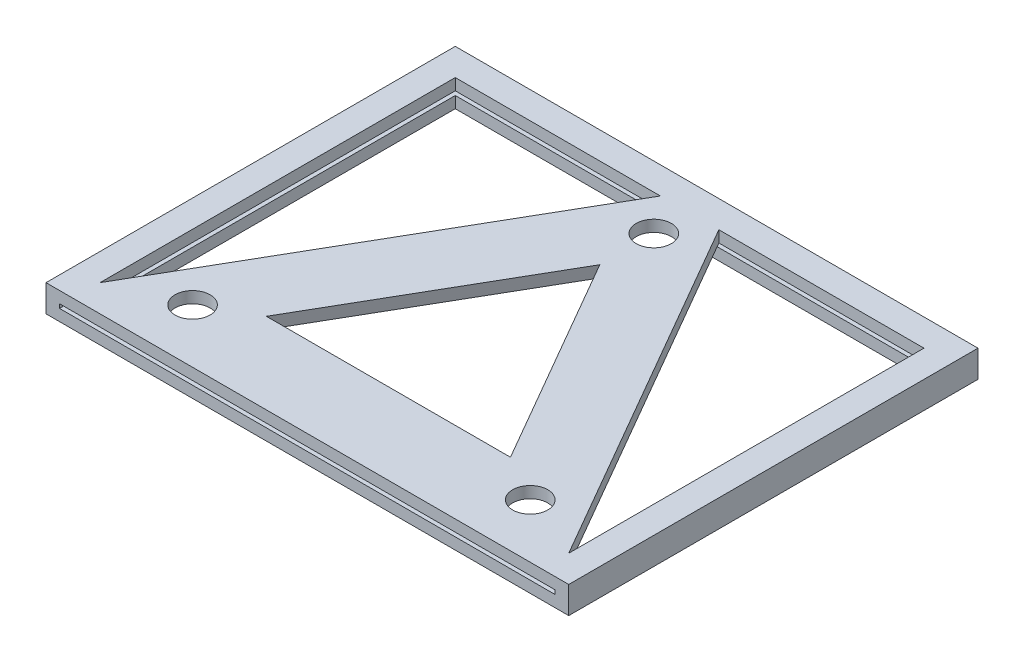
ISO-10303-21;
HEADER;
FILE_DESCRIPTION(('STEP AP214'),'2;1');
FILE_NAME('part.step','',(''),(''),'','','');
FILE_SCHEMA(('AUTOMOTIVE_DESIGN { 1 0 10303 214 1 1 1 1 }'));
ENDSEC;
DATA;
#1=APPLICATION_CONTEXT('core data for automotive mechanical design processes');
#2=APPLICATION_PROTOCOL_DEFINITION('international standard','automotive_design',2000,#1);
#3=PRODUCT_CONTEXT('',#1,'mechanical');
#4=PRODUCT('Part','Part','',(#3));
#5=PRODUCT_RELATED_PRODUCT_CATEGORY('part','',(#4));
#6=PRODUCT_DEFINITION_FORMATION('','',#4);
#7=PRODUCT_DEFINITION_CONTEXT('part definition',#1,'design');
#8=PRODUCT_DEFINITION('design','',#6,#7);
#9=PRODUCT_DEFINITION_SHAPE('','',#8);
#10=(LENGTH_UNIT() NAMED_UNIT(*) SI_UNIT(.MILLI.,.METRE.));
#11=(NAMED_UNIT(*) PLANE_ANGLE_UNIT() SI_UNIT($,.RADIAN.));
#12=(NAMED_UNIT(*) SI_UNIT($,.STERADIAN.) SOLID_ANGLE_UNIT());
#13=UNCERTAINTY_MEASURE_WITH_UNIT(LENGTH_MEASURE(1.E-05),#10,'distance_accuracy_value','');
#14=(GEOMETRIC_REPRESENTATION_CONTEXT(3) GLOBAL_UNCERTAINTY_ASSIGNED_CONTEXT((#13)) GLOBAL_UNIT_ASSIGNED_CONTEXT((#10,
#11,#12)) REPRESENTATION_CONTEXT('',''));
#15=CARTESIAN_POINT('',(0.,0.,0.));
#16=DIRECTION('',(0.,0.,1.));
#17=DIRECTION('',(1.,0.,0.));
#18=AXIS2_PLACEMENT_3D('',#15,#16,#17);
#19=CARTESIAN_POINT('',(0.,5.,46.0843918243516));
#20=DIRECTION('',(0.,0.,-1.));
#21=DIRECTION('',(-1.,0.,0.));
#22=AXIS2_PLACEMENT_3D('',#19,#20,#21);
#23=PLANE('',#22);
#24=DIRECTION('',(0.,-1.,0.));
#25=VECTOR('',#24,1.);
#26=CARTESIAN_POINT('',(-86.75,5.,46.0843918243516));
#27=LINE('',#26,#25);
#28=CARTESIAN_POINT('',(-86.75,-0.75,46.0843918243516));
#29=VERTEX_POINT('',#28);
#30=CARTESIAN_POINT('',(-86.75,-5.,46.0843918243516));
#31=VERTEX_POINT('',#30);
#32=EDGE_CURVE('E358',#29,#31,#27,.T.);
#33=ORIENTED_EDGE('',*,*,#32,.F.);
#34=DIRECTION('',(1.,0.,0.));
#35=VECTOR('',#34,1.);
#36=CARTESIAN_POINT('',(0.,-0.75,46.0843918243516));
#37=LINE('',#36,#35);
#38=CARTESIAN_POINT('',(86.75,-0.75,46.0843918243516));
#39=VERTEX_POINT('',#38);
#40=EDGE_CURVE('E287',#29,#39,#37,.T.);
#41=ORIENTED_EDGE('',*,*,#40,.T.);
#42=DIRECTION('',(0.,-1.,0.));
#43=VECTOR('',#42,1.);
#44=CARTESIAN_POINT('',(86.75,5.,46.0843918243516));
#45=LINE('',#44,#43);
#46=CARTESIAN_POINT('',(86.75,-5.,46.0843918243516));
#47=VERTEX_POINT('',#46);
#48=EDGE_CURVE('E323',#39,#47,#45,.T.);
#49=ORIENTED_EDGE('',*,*,#48,.T.);
#50=DIRECTION('',(1.,0.,0.));
#51=VECTOR('',#50,1.);
#52=CARTESIAN_POINT('',(0.,-5.,46.0843918243516));
#53=LINE('',#52,#51);
#54=EDGE_CURVE('E294',#31,#47,#53,.T.);
#55=ORIENTED_EDGE('',*,*,#54,.F.);
#56=EDGE_LOOP('',(#33,#41,#49,#55));
#57=FACE_BOUND('',#56,.T.);
#58=ADVANCED_FACE('F41',(#57),#23,.T.);
#59=CARTESIAN_POINT('',(0.,5.,-85.4156081756484));
#60=DIRECTION('',(0.,0.,-1.));
#61=DIRECTION('',(-1.,0.,0.));
#62=AXIS2_PLACEMENT_3D('',#59,#60,#61);
#63=PLANE('',#62);
#64=DIRECTION('',(1.,0.,0.));
#65=VECTOR('',#64,1.);
#66=CARTESIAN_POINT('',(0.,-0.75,-85.4156081756484));
#67=LINE('',#66,#65);
#68=CARTESIAN_POINT('',(-86.75,-0.75,-85.4156081756484));
#69=VERTEX_POINT('',#68);
#70=CARTESIAN_POINT('',(86.75,-0.75,-85.4156081756484));
#71=VERTEX_POINT('',#70);
#72=EDGE_CURVE('E284',#69,#71,#67,.T.);
#73=ORIENTED_EDGE('',*,*,#72,.F.);
#74=DIRECTION('',(0.,-1.,0.));
#75=VECTOR('',#74,1.);
#76=CARTESIAN_POINT('',(-86.75,5.,-85.4156081756484));
#77=LINE('',#76,#75);
#78=CARTESIAN_POINT('',(-86.75,-5.,-85.4156081756484));
#79=VERTEX_POINT('',#78);
#80=EDGE_CURVE('E376',#69,#79,#77,.T.);
#81=ORIENTED_EDGE('',*,*,#80,.T.);
#82=DIRECTION('',(1.,0.,0.));
#83=VECTOR('',#82,1.);
#84=CARTESIAN_POINT('',(0.,-5.,-85.4156081756484));
#85=LINE('',#84,#83);
#86=CARTESIAN_POINT('',(86.75,-5.,-85.4156081756484));
#87=VERTEX_POINT('',#86);
#88=EDGE_CURVE('E331',#79,#87,#85,.T.);
#89=ORIENTED_EDGE('',*,*,#88,.T.);
#90=DIRECTION('',(0.,-1.,0.));
#91=VECTOR('',#90,1.);
#92=CARTESIAN_POINT('',(86.75,5.,-85.4156081756484));
#93=LINE('',#92,#91);
#94=EDGE_CURVE('E371',#71,#87,#93,.T.);
#95=ORIENTED_EDGE('',*,*,#94,.F.);
#96=EDGE_LOOP('',(#73,#81,#89,#95));
#97=FACE_BOUND('',#96,.T.);
#98=ADVANCED_FACE('F481',(#97),#63,.F.);
#99=CARTESIAN_POINT('',(-86.75,5.,-85.4156081756484));
#100=VERTEX_POINT('',#99);
#101=CARTESIAN_POINT('',(-86.75,0.75,-85.4156081756484));
#102=VERTEX_POINT('',#101);
#103=EDGE_CURVE('E377',#100,#102,#77,.T.);
#104=ORIENTED_EDGE('',*,*,#103,.T.);
#105=DIRECTION('',(1.,0.,0.));
#106=VECTOR('',#105,1.);
#107=CARTESIAN_POINT('',(0.,0.75,-85.4156081756484));
#108=LINE('',#107,#106);
#109=CARTESIAN_POINT('',(-10.8284396015642,0.75,-85.4156081756484));
#110=VERTEX_POINT('',#109);
#111=EDGE_CURVE('E67',#102,#110,#108,.T.);
#112=ORIENTED_EDGE('',*,*,#111,.T.);
#113=DIRECTION('',(0.,-1.,0.));
#114=VECTOR('',#113,1.);
#115=CARTESIAN_POINT('',(-10.8284396015642,5.,-85.4156081756484));
#116=LINE('',#115,#114);
#117=CARTESIAN_POINT('',(-10.8284396015642,5.,-85.4156081756484));
#118=VERTEX_POINT('',#117);
#119=EDGE_CURVE('E413',#118,#110,#116,.T.);
#120=ORIENTED_EDGE('',*,*,#119,.F.);
#121=DIRECTION('',(1.,0.,0.));
#122=VECTOR('',#121,1.);
#123=CARTESIAN_POINT('',(0.,5.,-85.4156081756484));
#124=LINE('',#123,#122);
#125=EDGE_CURVE('E300',#100,#118,#124,.T.);
#126=ORIENTED_EDGE('',*,*,#125,.F.);
#127=EDGE_LOOP('',(#104,#112,#120,#126));
#128=FACE_BOUND('',#127,.T.);
#129=ADVANCED_FACE('F487',(#128),#63,.F.);
#130=CARTESIAN_POINT('',(-86.75,5.,0.));
#131=DIRECTION('',(-1.,0.,0.));
#132=DIRECTION('',(0.,0.,1.));
#133=AXIS2_PLACEMENT_3D('',#130,#131,#132);
#134=PLANE('',#133);
#135=DIRECTION('',(0.,0.,-1.));
#136=VECTOR('',#135,1.);
#137=CARTESIAN_POINT('',(-86.75,-0.75,0.));
#138=LINE('',#137,#136);
#139=EDGE_CURVE('E291',#29,#69,#138,.T.);
#140=ORIENTED_EDGE('',*,*,#139,.F.);
#141=ORIENTED_EDGE('',*,*,#32,.T.);
#142=DIRECTION('',(0.,0.,-1.));
#143=VECTOR('',#142,1.);
#144=CARTESIAN_POINT('',(-86.75,-5.,0.));
#145=LINE('',#144,#143);
#146=EDGE_CURVE('E327',#31,#79,#145,.T.);
#147=ORIENTED_EDGE('',*,*,#146,.T.);
#148=ORIENTED_EDGE('',*,*,#80,.F.);
#149=EDGE_LOOP('',(#140,#141,#147,#148));
#150=FACE_BOUND('',#149,.T.);
#151=ADVANCED_FACE('F474',(#150),#134,.F.);
#152=CARTESIAN_POINT('',(86.75,5.,0.));
#153=DIRECTION('',(-1.,0.,0.));
#154=DIRECTION('',(0.,0.,1.));
#155=AXIS2_PLACEMENT_3D('',#152,#153,#154);
#156=PLANE('',#155);
#157=ORIENTED_EDGE('',*,*,#48,.F.);
#158=DIRECTION('',(0.,0.,-1.));
#159=VECTOR('',#158,1.);
#160=CARTESIAN_POINT('',(86.75,-0.75,0.));
#161=LINE('',#160,#159);
#162=EDGE_CURVE('E280',#39,#71,#161,.T.);
#163=ORIENTED_EDGE('',*,*,#162,.T.);
#164=ORIENTED_EDGE('',*,*,#94,.T.);
#165=DIRECTION('',(0.,0.,-1.));
#166=VECTOR('',#165,1.);
#167=CARTESIAN_POINT('',(86.75,-5.,0.));
#168=LINE('',#167,#166);
#169=EDGE_CURVE('E335',#47,#87,#168,.T.);
#170=ORIENTED_EDGE('',*,*,#169,.F.);
#171=EDGE_LOOP('',(#157,#163,#164,#170));
#172=FACE_BOUND('',#171,.T.);
#173=ADVANCED_FACE('F464',(#172),#156,.T.);
#174=CARTESIAN_POINT('',(0.,5.,56.0843918243516));
#175=DIRECTION('',(0.,0.,-1.));
#176=DIRECTION('',(-1.,0.,0.));
#177=AXIS2_PLACEMENT_3D('',#174,#175,#176);
#178=PLANE('',#177);
#179=DIRECTION('',(1.,0.,0.));
#180=VECTOR('',#179,1.);
#181=CARTESIAN_POINT('',(0.,-5.,56.0843918243516));
#182=LINE('',#181,#180);
#183=CARTESIAN_POINT('',(-96.75,-5.,56.0843918243516));
#184=VERTEX_POINT('',#183);
#185=CARTESIAN_POINT('',(96.75,-5.,56.0843918243516));
#186=VERTEX_POINT('',#185);
#187=EDGE_CURVE('E299',#184,#186,#182,.T.);
#188=ORIENTED_EDGE('',*,*,#187,.T.);
#189=DIRECTION('',(0.,-1.,0.));
#190=VECTOR('',#189,1.);
#191=CARTESIAN_POINT('',(96.75,5.,56.0843918243516));
#192=LINE('',#191,#190);
#193=CARTESIAN_POINT('',(96.75,5.,56.0843918243516));
#194=VERTEX_POINT('',#193);
#195=EDGE_CURVE('E354',#194,#186,#192,.T.);
#196=ORIENTED_EDGE('',*,*,#195,.F.);
#197=DIRECTION('',(1.,0.,0.));
#198=VECTOR('',#197,1.);
#199=CARTESIAN_POINT('',(0.,5.,56.0843918243516));
#200=LINE('',#199,#198);
#201=CARTESIAN_POINT('',(-96.75,5.,56.0843918243516));
#202=VERTEX_POINT('',#201);
#203=EDGE_CURVE('E320',#202,#194,#200,.T.);
#204=ORIENTED_EDGE('',*,*,#203,.F.);
#205=DIRECTION('',(0.,-1.,0.));
#206=VECTOR('',#205,1.);
#207=CARTESIAN_POINT('',(-96.75,5.,56.0843918243516));
#208=LINE('',#207,#206);
#209=EDGE_CURVE('E357',#202,#184,#208,.T.);
#210=ORIENTED_EDGE('',*,*,#209,.T.);
#211=EDGE_LOOP('',(#188,#196,#204,#210));
#212=FACE_BOUND('',#211,.T.);
#213=DIRECTION('',(1.,0.,0.));
#214=VECTOR('',#213,1.);
#215=CARTESIAN_POINT('',(-91.75,-0.75,56.0843918243516));
#216=LINE('',#215,#214);
#217=CARTESIAN_POINT('',(-91.75,-0.75,56.0843918243516));
#218=VERTEX_POINT('',#217);
#219=CARTESIAN_POINT('',(91.75,-0.75,56.0843918243516));
#220=VERTEX_POINT('',#219);
#221=EDGE_CURVE('E215',#218,#220,#216,.T.);
#222=ORIENTED_EDGE('',*,*,#221,.F.);
#223=DIRECTION('',(0.,1.,0.));
#224=VECTOR('',#223,1.);
#225=CARTESIAN_POINT('',(-91.75,-0.75,56.0843918243516));
#226=LINE('',#225,#224);
#227=CARTESIAN_POINT('',(-91.75,0.75,56.0843918243516));
#228=VERTEX_POINT('',#227);
#229=EDGE_CURVE('E238',#218,#228,#226,.T.);
#230=ORIENTED_EDGE('',*,*,#229,.T.);
#231=DIRECTION('',(1.,0.,0.));
#232=VECTOR('',#231,1.);
#233=CARTESIAN_POINT('',(-91.75,0.75,56.0843918243516));
#234=LINE('',#233,#232);
#235=CARTESIAN_POINT('',(91.75,0.75,56.0843918243516));
#236=VERTEX_POINT('',#235);
#237=EDGE_CURVE('E230',#228,#236,#234,.T.);
#238=ORIENTED_EDGE('',*,*,#237,.T.);
#239=DIRECTION('',(0.,1.,0.));
#240=VECTOR('',#239,1.);
#241=CARTESIAN_POINT('',(91.75,-0.75,56.0843918243516));
#242=LINE('',#241,#240);
#243=EDGE_CURVE('E210',#220,#236,#242,.T.);
#244=ORIENTED_EDGE('',*,*,#243,.F.);
#245=EDGE_LOOP('',(#222,#230,#238,#244));
#246=FACE_BOUND('',#245,.T.);
#247=ADVANCED_FACE('F461',(#212,#246),#178,.F.);
#248=CARTESIAN_POINT('',(-45.1073729810778,5.,-26.0427539330621));
#249=DIRECTION('',(0.866025403784439,0.,0.5));
#250=DIRECTION('',(0.5,0.,-0.866025403784439));
#251=AXIS2_PLACEMENT_3D('',#248,#249,#250);
#252=PLANE('',#251);
#253=ORIENTED_EDGE('',*,*,#119,.T.);
#254=DIRECTION('',(-0.5,0.,0.866025403784439));
#255=VECTOR('',#254,1.);
#256=CARTESIAN_POINT('',(-45.1073729810778,0.75,-26.0427539330621));
#257=LINE('',#256,#255);
#258=CARTESIAN_POINT('',(-86.75,0.75,46.0843918243516));
#259=VERTEX_POINT('',#258);
#260=EDGE_CURVE('E256',#110,#259,#257,.T.);
#261=ORIENTED_EDGE('',*,*,#260,.T.);
#262=DIRECTION('',(0.,-1.,0.));
#263=VECTOR('',#262,1.);
#264=CARTESIAN_POINT('',(-86.75,5.,46.0843918243516));
#265=LINE('',#264,#263);
#266=CARTESIAN_POINT('',(-86.75,5.,46.0843918243516));
#267=VERTEX_POINT('',#266);
#268=EDGE_CURVE('E11',#267,#259,#265,.T.);
#269=ORIENTED_EDGE('',*,*,#268,.F.);
#270=DIRECTION('',(-0.5,0.,0.866025403784439));
#271=VECTOR('',#270,1.);
#272=CARTESIAN_POINT('',(-45.1073729810778,5.,-26.0427539330621));
#273=LINE('',#272,#271);
#274=EDGE_CURVE('E406',#118,#267,#273,.T.);
#275=ORIENTED_EDGE('',*,*,#274,.F.);
#276=EDGE_LOOP('',(#253,#261,#269,#275));
#277=FACE_BOUND('',#276,.T.);
#278=ADVANCED_FACE('F463',(#277),#252,.F.);
#279=CARTESIAN_POINT('',(45.1073729810778,5.,-26.0427539330621));
#280=DIRECTION('',(0.866025403784439,0.,-0.5));
#281=DIRECTION('',(-0.5,0.,-0.866025403784439));
#282=AXIS2_PLACEMENT_3D('',#279,#280,#281);
#283=PLANE('',#282);
#284=DIRECTION('',(0.5,0.,0.866025403784439));
#285=VECTOR('',#284,1.);
#286=CARTESIAN_POINT('',(45.1073729810778,0.75,-26.0427539330621));
#287=LINE('',#286,#285);
#288=CARTESIAN_POINT('',(10.8284396015642,0.75,-85.4156081756484));
#289=VERTEX_POINT('',#288);
#290=CARTESIAN_POINT('',(86.75,0.75,46.0843918243516));
#291=VERTEX_POINT('',#290);
#292=EDGE_CURVE('E250',#289,#291,#287,.T.);
#293=ORIENTED_EDGE('',*,*,#292,.F.);
#294=DIRECTION('',(0.,-1.,0.));
#295=VECTOR('',#294,1.);
#296=CARTESIAN_POINT('',(10.8284396015642,5.,-85.4156081756484));
#297=LINE('',#296,#295);
#298=CARTESIAN_POINT('',(10.8284396015642,5.,-85.4156081756484));
#299=VERTEX_POINT('',#298);
#300=EDGE_CURVE('E417',#299,#289,#297,.T.);
#301=ORIENTED_EDGE('',*,*,#300,.F.);
#302=DIRECTION('',(0.5,0.,0.866025403784439));
#303=VECTOR('',#302,1.);
#304=CARTESIAN_POINT('',(45.1073729810778,5.,-26.0427539330621));
#305=LINE('',#304,#303);
#306=CARTESIAN_POINT('',(86.75,5.,46.0843918243516));
#307=VERTEX_POINT('',#306);
#308=EDGE_CURVE('E409',#299,#307,#305,.T.);
#309=ORIENTED_EDGE('',*,*,#308,.T.);
#310=DIRECTION('',(0.,-1.,0.));
#311=VECTOR('',#310,1.);
#312=CARTESIAN_POINT('',(86.75,5.,46.0843918243516));
#313=LINE('',#312,#311);
#314=EDGE_CURVE('E51',#307,#291,#313,.T.);
#315=ORIENTED_EDGE('',*,*,#314,.T.);
#316=EDGE_LOOP('',(#293,#301,#309,#315));
#317=FACE_BOUND('',#316,.T.);
#318=ADVANCED_FACE('F471',(#317),#283,.T.);
#319=CARTESIAN_POINT('',(22.5897459621556,5.,-13.0421959121758));
#320=DIRECTION('',(-0.866025403784439,0.,0.5));
#321=DIRECTION('',(0.5,0.,0.866025403784439));
#322=AXIS2_PLACEMENT_3D('',#319,#320,#321);
#323=PLANE('',#322);
#324=DIRECTION('',(-0.5,0.,-0.866025403784439));
#325=VECTOR('',#324,1.);
#326=CARTESIAN_POINT('',(22.5897459621556,0.75,-13.0421959121758));
#327=LINE('',#326,#325);
#328=CARTESIAN_POINT('',(45.1794919243112,0.75,26.0843918243516));
#329=VERTEX_POINT('',#328);
#330=CARTESIAN_POINT('',(0.,0.75,-52.1687836487032));
#331=VERTEX_POINT('',#330);
#332=EDGE_CURVE('E59',#329,#331,#327,.T.);
#333=ORIENTED_EDGE('',*,*,#332,.F.);
#334=DIRECTION('',(0.,-1.,0.));
#335=VECTOR('',#334,1.);
#336=CARTESIAN_POINT('',(45.1794919243112,5.,26.0843918243516));
#337=LINE('',#336,#335);
#338=CARTESIAN_POINT('',(45.1794919243112,5.,26.0843918243516));
#339=VERTEX_POINT('',#338);
#340=EDGE_CURVE('E45',#339,#329,#337,.T.);
#341=ORIENTED_EDGE('',*,*,#340,.F.);
#342=DIRECTION('',(-0.5,0.,-0.866025403784439));
#343=VECTOR('',#342,1.);
#344=CARTESIAN_POINT('',(22.5897459621556,5.,-13.0421959121758));
#345=LINE('',#344,#343);
#346=CARTESIAN_POINT('',(0.,5.,-52.1687836487032));
#347=VERTEX_POINT('',#346);
#348=EDGE_CURVE('E394',#339,#347,#345,.T.);
#349=ORIENTED_EDGE('',*,*,#348,.T.);
#350=DIRECTION('',(0.,-1.,0.));
#351=VECTOR('',#350,1.);
#352=CARTESIAN_POINT('',(0.,5.,-52.1687836487032));
#353=LINE('',#352,#351);
#354=EDGE_CURVE('E412',#347,#331,#353,.T.);
#355=ORIENTED_EDGE('',*,*,#354,.T.);
#356=EDGE_LOOP('',(#333,#341,#349,#355));
#357=FACE_BOUND('',#356,.T.);
#358=ADVANCED_FACE('F438',(#357),#323,.T.);
#359=CARTESIAN_POINT('',(0.,5.,26.0843918243516));
#360=DIRECTION('',(0.,0.,-1.));
#361=DIRECTION('',(-1.,0.,0.));
#362=AXIS2_PLACEMENT_3D('',#359,#360,#361);
#363=PLANE('',#362);
#364=DIRECTION('',(1.,0.,0.));
#365=VECTOR('',#364,1.);
#366=CARTESIAN_POINT('',(0.,0.75,26.0843918243516));
#367=LINE('',#366,#365);
#368=CARTESIAN_POINT('',(-45.1794919243112,0.75,26.0843918243516));
#369=VERTEX_POINT('',#368);
#370=EDGE_CURVE('E275',#369,#329,#367,.T.);
#371=ORIENTED_EDGE('',*,*,#370,.F.);
#372=DIRECTION('',(0.,-1.,0.));
#373=VECTOR('',#372,1.);
#374=CARTESIAN_POINT('',(-45.1794919243112,5.,26.0843918243516));
#375=LINE('',#374,#373);
#376=CARTESIAN_POINT('',(-45.1794919243112,5.,26.0843918243516));
#377=VERTEX_POINT('',#376);
#378=EDGE_CURVE('E426',#377,#369,#375,.T.);
#379=ORIENTED_EDGE('',*,*,#378,.F.);
#380=DIRECTION('',(1.,0.,0.));
#381=VECTOR('',#380,1.);
#382=CARTESIAN_POINT('',(0.,5.,26.0843918243516));
#383=LINE('',#382,#381);
#384=EDGE_CURVE('E398',#377,#339,#383,.T.);
#385=ORIENTED_EDGE('',*,*,#384,.T.);
#386=ORIENTED_EDGE('',*,*,#340,.T.);
#387=EDGE_LOOP('',(#371,#379,#385,#386));
#388=FACE_BOUND('',#387,.T.);
#389=ADVANCED_FACE('F434',(#388),#363,.T.);
#390=CARTESIAN_POINT('',(-22.5897459621556,5.,-13.0421959121758));
#391=DIRECTION('',(0.866025403784439,0.,0.5));
#392=DIRECTION('',(0.5,0.,-0.866025403784439));
#393=AXIS2_PLACEMENT_3D('',#390,#391,#392);
#394=PLANE('',#393);
#395=DIRECTION('',(-0.5,0.,0.866025403784439));
#396=VECTOR('',#395,1.);
#397=CARTESIAN_POINT('',(-22.5897459621556,0.75,-13.0421959121758));
#398=LINE('',#397,#396);
#399=EDGE_CURVE('E272',#331,#369,#398,.T.);
#400=ORIENTED_EDGE('',*,*,#399,.F.);
#401=ORIENTED_EDGE('',*,*,#354,.F.);
#402=DIRECTION('',(-0.5,0.,0.866025403784439));
#403=VECTOR('',#402,1.);
#404=CARTESIAN_POINT('',(-22.5897459621556,5.,-13.0421959121758));
#405=LINE('',#404,#403);
#406=EDGE_CURVE('E402',#347,#377,#405,.T.);
#407=ORIENTED_EDGE('',*,*,#406,.T.);
#408=ORIENTED_EDGE('',*,*,#378,.T.);
#409=EDGE_LOOP('',(#400,#401,#407,#408));
#410=FACE_BOUND('',#409,.T.);
#411=ADVANCED_FACE('F443',(#410),#394,.T.);
#412=CARTESIAN_POINT('',(0.,5.,-72.1687836487032));
#413=DIRECTION('',(0.,-1.,0.));
#414=DIRECTION('',(0.,0.,-1.));
#415=AXIS2_PLACEMENT_3D('',#412,#413,#414);
#416=CYLINDRICAL_SURFACE('',#415,6.5);
#417=CARTESIAN_POINT('',(0.,0.75,-72.1687836487032));
#418=DIRECTION('',(0.,1.,0.));
#419=DIRECTION('',(0.,0.,1.));
#420=AXIS2_PLACEMENT_3D('',#417,#418,#419);
#421=CIRCLE('',#420,6.5);
#422=CARTESIAN_POINT('',(0.,0.75,-65.6687836487032));
#423=VERTEX_POINT('',#422);
#424=EDGE_CURVE('E268',#423,#423,#421,.T.);
#425=ORIENTED_EDGE('',*,*,#424,.F.);
#426=EDGE_LOOP('',(#425));
#427=FACE_BOUND('',#426,.T.);
#428=CARTESIAN_POINT('',(0.,5.,-72.1687836487032));
#429=DIRECTION('',(0.,1.,0.));
#430=DIRECTION('',(0.,0.,1.));
#431=AXIS2_PLACEMENT_3D('',#428,#429,#430);
#432=CIRCLE('',#431,6.5);
#433=CARTESIAN_POINT('',(0.,5.,-65.6687836487032));
#434=VERTEX_POINT('',#433);
#435=EDGE_CURVE('E390',#434,#434,#432,.T.);
#436=ORIENTED_EDGE('',*,*,#435,.T.);
#437=EDGE_LOOP('',(#436));
#438=FACE_BOUND('',#437,.T.);
#439=ADVANCED_FACE('F503',(#427,#438),#416,.F.);
#440=CARTESIAN_POINT('',(62.5,5.,36.0843918243516));
#441=DIRECTION('',(0.,-1.,0.));
#442=DIRECTION('',(0.,0.,-1.));
#443=AXIS2_PLACEMENT_3D('',#440,#441,#442);
#444=CYLINDRICAL_SURFACE('',#443,6.49999999999999);
#445=CARTESIAN_POINT('',(62.5,0.75,36.0843918243516));
#446=DIRECTION('',(0.,1.,0.));
#447=DIRECTION('',(0.,0.,1.));
#448=AXIS2_PLACEMENT_3D('',#445,#446,#447);
#449=CIRCLE('',#448,6.49999999999999);
#450=CARTESIAN_POINT('',(62.5,0.75,42.5843918243516));
#451=VERTEX_POINT('',#450);
#452=EDGE_CURVE('E264',#451,#451,#449,.T.);
#453=ORIENTED_EDGE('',*,*,#452,.F.);
#454=EDGE_LOOP('',(#453));
#455=FACE_BOUND('',#454,.T.);
#456=CARTESIAN_POINT('',(62.5,5.,36.0843918243516));
#457=DIRECTION('',(0.,1.,0.));
#458=DIRECTION('',(0.,0.,1.));
#459=AXIS2_PLACEMENT_3D('',#456,#457,#458);
#460=CIRCLE('',#459,6.49999999999999);
#461=CARTESIAN_POINT('',(62.5,5.,42.5843918243516));
#462=VERTEX_POINT('',#461);
#463=EDGE_CURVE('E386',#462,#462,#460,.T.);
#464=ORIENTED_EDGE('',*,*,#463,.T.);
#465=EDGE_LOOP('',(#464));
#466=FACE_BOUND('',#465,.T.);
#467=ADVANCED_FACE('F509',(#455,#466),#444,.F.);
#468=CARTESIAN_POINT('',(-62.5,5.,36.0843918243516));
#469=DIRECTION('',(0.,-1.,0.));
#470=DIRECTION('',(0.,0.,-1.));
#471=AXIS2_PLACEMENT_3D('',#468,#469,#470);
#472=CYLINDRICAL_SURFACE('',#471,6.5);
#473=CARTESIAN_POINT('',(-62.5,0.75,36.0843918243516));
#474=DIRECTION('',(0.,1.,0.));
#475=DIRECTION('',(0.,0.,1.));
#476=AXIS2_PLACEMENT_3D('',#473,#474,#475);
#477=CIRCLE('',#476,6.5);
#478=CARTESIAN_POINT('',(-62.5,0.75,42.5843918243516));
#479=VERTEX_POINT('',#478);
#480=EDGE_CURVE('E260',#479,#479,#477,.T.);
#481=ORIENTED_EDGE('',*,*,#480,.F.);
#482=EDGE_LOOP('',(#481));
#483=FACE_BOUND('',#482,.T.);
#484=CARTESIAN_POINT('',(-62.5,5.,36.0843918243516));
#485=DIRECTION('',(0.,1.,0.));
#486=DIRECTION('',(0.,0.,1.));
#487=AXIS2_PLACEMENT_3D('',#484,#485,#486);
#488=CIRCLE('',#487,6.5);
#489=CARTESIAN_POINT('',(-62.5,5.,42.5843918243516));
#490=VERTEX_POINT('',#489);
#491=EDGE_CURVE('E368',#490,#490,#488,.T.);
#492=ORIENTED_EDGE('',*,*,#491,.T.);
#493=EDGE_LOOP('',(#492));
#494=FACE_BOUND('',#493,.T.);
#495=ADVANCED_FACE('F43',(#483,#494),#472,.F.);
#496=CARTESIAN_POINT('',(0.,5.,0.));
#497=DIRECTION('',(0.,1.,0.));
#498=DIRECTION('',(0.,0.,1.));
#499=AXIS2_PLACEMENT_3D('',#496,#497,#498);
#500=PLANE('',#499);
#501=DIRECTION('',(0.,0.,-1.));
#502=VECTOR('',#501,1.);
#503=CARTESIAN_POINT('',(86.75,5.,0.));
#504=LINE('',#503,#502);
#505=CARTESIAN_POINT('',(86.75,5.,-85.4156081756484));
#506=VERTEX_POINT('',#505);
#507=EDGE_CURVE('E304',#307,#506,#504,.T.);
#508=ORIENTED_EDGE('',*,*,#507,.F.);
#509=ORIENTED_EDGE('',*,*,#308,.F.);
#510=EDGE_CURVE('E298',#299,#506,#124,.T.);
#511=ORIENTED_EDGE('',*,*,#510,.T.);
#512=EDGE_LOOP('',(#508,#509,#511));
#513=FACE_BOUND('',#512,.T.);
#514=ORIENTED_EDGE('',*,*,#491,.F.);
#515=EDGE_LOOP('',(#514));
#516=FACE_BOUND('',#515,.T.);
#517=ORIENTED_EDGE('',*,*,#463,.F.);
#518=EDGE_LOOP('',(#517));
#519=FACE_BOUND('',#518,.T.);
#520=ORIENTED_EDGE('',*,*,#435,.F.);
#521=EDGE_LOOP('',(#520));
#522=FACE_BOUND('',#521,.T.);
#523=ORIENTED_EDGE('',*,*,#348,.F.);
#524=ORIENTED_EDGE('',*,*,#384,.F.);
#525=ORIENTED_EDGE('',*,*,#406,.F.);
#526=EDGE_LOOP('',(#523,#524,#525));
#527=FACE_BOUND('',#526,.T.);
#528=ORIENTED_EDGE('',*,*,#274,.T.);
#529=DIRECTION('',(0.,0.,-1.));
#530=VECTOR('',#529,1.);
#531=CARTESIAN_POINT('',(-86.75,5.,0.));
#532=LINE('',#531,#530);
#533=EDGE_CURVE('E295',#267,#100,#532,.T.);
#534=ORIENTED_EDGE('',*,*,#533,.T.);
#535=ORIENTED_EDGE('',*,*,#125,.T.);
#536=EDGE_LOOP('',(#528,#534,#535));
#537=FACE_BOUND('',#536,.T.);
#538=DIRECTION('',(0.,0.,1.));
#539=VECTOR('',#538,1.);
#540=CARTESIAN_POINT('',(96.75,5.,0.));
#541=LINE('',#540,#539);
#542=CARTESIAN_POINT('',(96.75,5.,-95.4156081756484));
#543=VERTEX_POINT('',#542);
#544=EDGE_CURVE('E308',#543,#194,#541,.T.);
#545=ORIENTED_EDGE('',*,*,#544,.F.);
#546=DIRECTION('',(1.,0.,0.));
#547=VECTOR('',#546,1.);
#548=CARTESIAN_POINT('',(0.,5.,-95.4156081756484));
#549=LINE('',#548,#547);
#550=CARTESIAN_POINT('',(-96.75,5.,-95.4156081756484));
#551=VERTEX_POINT('',#550);
#552=EDGE_CURVE('E312',#551,#543,#549,.T.);
#553=ORIENTED_EDGE('',*,*,#552,.F.);
#554=DIRECTION('',(0.,0.,1.));
#555=VECTOR('',#554,1.);
#556=CARTESIAN_POINT('',(-96.75,5.,0.));
#557=LINE('',#556,#555);
#558=EDGE_CURVE('E316',#551,#202,#557,.T.);
#559=ORIENTED_EDGE('',*,*,#558,.T.);
#560=ORIENTED_EDGE('',*,*,#203,.T.);
#561=EDGE_LOOP('',(#545,#553,#559,#560));
#562=FACE_BOUND('',#561,.T.);
#563=ADVANCED_FACE('F441',(#513,#516,#519,#522,#527,#537,#562),#500,.T.);
#564=ORIENTED_EDGE('',*,*,#300,.T.);
#565=CARTESIAN_POINT('',(86.75,0.75,-85.4156081756484));
#566=VERTEX_POINT('',#565);
#567=EDGE_CURVE('E246',#289,#566,#108,.T.);
#568=ORIENTED_EDGE('',*,*,#567,.T.);
#569=EDGE_CURVE('E372',#506,#566,#93,.T.);
#570=ORIENTED_EDGE('',*,*,#569,.F.);
#571=ORIENTED_EDGE('',*,*,#510,.F.);
#572=EDGE_LOOP('',(#564,#568,#570,#571));
#573=FACE_BOUND('',#572,.T.);
#574=ADVANCED_FACE('F490',(#573),#63,.F.);
#575=CARTESIAN_POINT('',(96.75,5.,0.));
#576=DIRECTION('',(1.,0.,0.));
#577=DIRECTION('',(0.,0.,-1.));
#578=AXIS2_PLACEMENT_3D('',#575,#576,#577);
#579=PLANE('',#578);
#580=DIRECTION('',(0.,0.,1.));
#581=VECTOR('',#580,1.);
#582=CARTESIAN_POINT('',(96.75,-5.,0.));
#583=LINE('',#582,#581);
#584=CARTESIAN_POINT('',(96.75,-5.,-95.4156081756484));
#585=VERTEX_POINT('',#584);
#586=EDGE_CURVE('E339',#585,#186,#583,.T.);
#587=ORIENTED_EDGE('',*,*,#586,.F.);
#588=DIRECTION('',(0.,-1.,0.));
#589=VECTOR('',#588,1.);
#590=CARTESIAN_POINT('',(96.75,5.,-95.4156081756484));
#591=LINE('',#590,#589);
#592=EDGE_CURVE('E365',#543,#585,#591,.T.);
#593=ORIENTED_EDGE('',*,*,#592,.F.);
#594=ORIENTED_EDGE('',*,*,#544,.T.);
#595=ORIENTED_EDGE('',*,*,#195,.T.);
#596=EDGE_LOOP('',(#587,#593,#594,#595));
#597=FACE_BOUND('',#596,.T.);
#598=ADVANCED_FACE('F539',(#597),#579,.T.);
#599=CARTESIAN_POINT('',(0.,5.,-95.4156081756484));
#600=DIRECTION('',(0.,0.,-1.));
#601=DIRECTION('',(-1.,0.,0.));
#602=AXIS2_PLACEMENT_3D('',#599,#600,#601);
#603=PLANE('',#602);
#604=DIRECTION('',(1.,0.,0.));
#605=VECTOR('',#604,1.);
#606=CARTESIAN_POINT('',(0.,-5.,-95.4156081756484));
#607=LINE('',#606,#605);
#608=CARTESIAN_POINT('',(-96.75,-5.,-95.4156081756484));
#609=VERTEX_POINT('',#608);
#610=EDGE_CURVE('E343',#609,#585,#607,.T.);
#611=ORIENTED_EDGE('',*,*,#610,.F.);
#612=DIRECTION('',(0.,-1.,0.));
#613=VECTOR('',#612,1.);
#614=CARTESIAN_POINT('',(-96.75,5.,-95.4156081756484));
#615=LINE('',#614,#613);
#616=EDGE_CURVE('E362',#551,#609,#615,.T.);
#617=ORIENTED_EDGE('',*,*,#616,.F.);
#618=ORIENTED_EDGE('',*,*,#552,.T.);
#619=ORIENTED_EDGE('',*,*,#592,.T.);
#620=EDGE_LOOP('',(#611,#617,#618,#619));
#621=FACE_BOUND('',#620,.T.);
#622=ADVANCED_FACE('F546',(#621),#603,.T.);
#623=CARTESIAN_POINT('',(-96.75,5.,0.));
#624=DIRECTION('',(1.,0.,0.));
#625=DIRECTION('',(0.,0.,-1.));
#626=AXIS2_PLACEMENT_3D('',#623,#624,#625);
#627=PLANE('',#626);
#628=DIRECTION('',(0.,0.,1.));
#629=VECTOR('',#628,1.);
#630=CARTESIAN_POINT('',(-96.75,-5.,0.));
#631=LINE('',#630,#629);
#632=EDGE_CURVE('E347',#609,#184,#631,.T.);
#633=ORIENTED_EDGE('',*,*,#632,.T.);
#634=ORIENTED_EDGE('',*,*,#209,.F.);
#635=ORIENTED_EDGE('',*,*,#558,.F.);
#636=ORIENTED_EDGE('',*,*,#616,.T.);
#637=EDGE_LOOP('',(#633,#634,#635,#636));
#638=FACE_BOUND('',#637,.T.);
#639=ADVANCED_FACE('F554',(#638),#627,.F.);
#640=ORIENTED_EDGE('',*,*,#268,.T.);
#641=DIRECTION('',(0.,0.,-1.));
#642=VECTOR('',#641,1.);
#643=CARTESIAN_POINT('',(-86.75,0.75,0.));
#644=LINE('',#643,#642);
#645=EDGE_CURVE('E253',#259,#102,#644,.T.);
#646=ORIENTED_EDGE('',*,*,#645,.T.);
#647=ORIENTED_EDGE('',*,*,#103,.F.);
#648=ORIENTED_EDGE('',*,*,#533,.F.);
#649=EDGE_LOOP('',(#640,#646,#647,#648));
#650=FACE_BOUND('',#649,.T.);
#651=ADVANCED_FACE('F494',(#650),#134,.F.);
#652=DIRECTION('',(0.,0.,-1.));
#653=VECTOR('',#652,1.);
#654=CARTESIAN_POINT('',(86.75,0.75,0.));
#655=LINE('',#654,#653);
#656=EDGE_CURVE('E209',#291,#566,#655,.T.);
#657=ORIENTED_EDGE('',*,*,#656,.F.);
#658=ORIENTED_EDGE('',*,*,#314,.F.);
#659=ORIENTED_EDGE('',*,*,#507,.T.);
#660=ORIENTED_EDGE('',*,*,#569,.T.);
#661=EDGE_LOOP('',(#657,#658,#659,#660));
#662=FACE_BOUND('',#661,.T.);
#663=ADVANCED_FACE('F477',(#662),#156,.T.);
#664=CARTESIAN_POINT('',(0.,-5.,0.));
#665=DIRECTION('',(0.,1.,0.));
#666=DIRECTION('',(0.,0.,1.));
#667=AXIS2_PLACEMENT_3D('',#664,#665,#666);
#668=PLANE('',#667);
#669=ORIENTED_EDGE('',*,*,#54,.T.);
#670=ORIENTED_EDGE('',*,*,#169,.T.);
#671=ORIENTED_EDGE('',*,*,#88,.F.);
#672=ORIENTED_EDGE('',*,*,#146,.F.);
#673=EDGE_LOOP('',(#669,#670,#671,#672));
#674=FACE_BOUND('',#673,.T.);
#675=ORIENTED_EDGE('',*,*,#586,.T.);
#676=ORIENTED_EDGE('',*,*,#187,.F.);
#677=ORIENTED_EDGE('',*,*,#632,.F.);
#678=ORIENTED_EDGE('',*,*,#610,.T.);
#679=EDGE_LOOP('',(#675,#676,#677,#678));
#680=FACE_BOUND('',#679,.T.);
#681=ADVANCED_FACE('F574',(#674,#680),#668,.F.);
#682=CARTESIAN_POINT('',(0.,-0.75,0.));
#683=DIRECTION('',(0.,1.,0.));
#684=DIRECTION('',(0.,0.,1.));
#685=AXIS2_PLACEMENT_3D('',#682,#683,#684);
#686=PLANE('',#685);
#687=DIRECTION('',(1.,0.,0.));
#688=VECTOR('',#687,1.);
#689=CARTESIAN_POINT('',(-91.75,-0.75,-90.4156081756484));
#690=LINE('',#689,#688);
#691=CARTESIAN_POINT('',(-91.75,-0.75,-90.4156081756484));
#692=VERTEX_POINT('',#691);
#693=CARTESIAN_POINT('',(91.75,-0.75,-90.4156081756484));
#694=VERTEX_POINT('',#693);
#695=EDGE_CURVE('E187',#692,#694,#690,.T.);
#696=ORIENTED_EDGE('',*,*,#695,.F.);
#697=DIRECTION('',(0.,0.,-1.));
#698=VECTOR('',#697,1.);
#699=CARTESIAN_POINT('',(-91.75,-0.75,56.0843918243516));
#700=LINE('',#699,#698);
#701=EDGE_CURVE('E220',#218,#692,#700,.T.);
#702=ORIENTED_EDGE('',*,*,#701,.F.);
#703=ORIENTED_EDGE('',*,*,#221,.T.);
#704=DIRECTION('',(0.,0.,-1.));
#705=VECTOR('',#704,1.);
#706=CARTESIAN_POINT('',(91.75,-0.75,56.0843918243516));
#707=LINE('',#706,#705);
#708=EDGE_CURVE('E199',#220,#694,#707,.T.);
#709=ORIENTED_EDGE('',*,*,#708,.T.);
#710=EDGE_LOOP('',(#696,#702,#703,#709));
#711=FACE_BOUND('',#710,.T.);
#712=ORIENTED_EDGE('',*,*,#139,.T.);
#713=ORIENTED_EDGE('',*,*,#72,.T.);
#714=ORIENTED_EDGE('',*,*,#162,.F.);
#715=ORIENTED_EDGE('',*,*,#40,.F.);
#716=EDGE_LOOP('',(#712,#713,#714,#715));
#717=FACE_BOUND('',#716,.T.);
#718=ADVANCED_FACE('F212',(#711,#717),#686,.T.);
#719=CARTESIAN_POINT('',(0.,0.75,0.));
#720=DIRECTION('',(0.,1.,0.));
#721=DIRECTION('',(0.,0.,1.));
#722=AXIS2_PLACEMENT_3D('',#719,#720,#721);
#723=PLANE('',#722);
#724=ORIENTED_EDGE('',*,*,#332,.T.);
#725=ORIENTED_EDGE('',*,*,#399,.T.);
#726=ORIENTED_EDGE('',*,*,#370,.T.);
#727=EDGE_LOOP('',(#724,#725,#726));
#728=FACE_BOUND('',#727,.T.);
#729=ORIENTED_EDGE('',*,*,#424,.T.);
#730=EDGE_LOOP('',(#729));
#731=FACE_BOUND('',#730,.T.);
#732=ORIENTED_EDGE('',*,*,#452,.T.);
#733=EDGE_LOOP('',(#732));
#734=FACE_BOUND('',#733,.T.);
#735=ORIENTED_EDGE('',*,*,#480,.T.);
#736=EDGE_LOOP('',(#735));
#737=FACE_BOUND('',#736,.T.);
#738=ORIENTED_EDGE('',*,*,#292,.T.);
#739=ORIENTED_EDGE('',*,*,#656,.T.);
#740=ORIENTED_EDGE('',*,*,#567,.F.);
#741=EDGE_LOOP('',(#738,#739,#740));
#742=FACE_BOUND('',#741,.T.);
#743=DIRECTION('',(1.,0.,0.));
#744=VECTOR('',#743,1.);
#745=CARTESIAN_POINT('',(-91.75,0.75,-90.4156081756484));
#746=LINE('',#745,#744);
#747=CARTESIAN_POINT('',(-91.75,0.75,-90.4156081756484));
#748=VERTEX_POINT('',#747);
#749=CARTESIAN_POINT('',(91.75,0.75,-90.4156081756484));
#750=VERTEX_POINT('',#749);
#751=EDGE_CURVE('E225',#748,#750,#746,.T.);
#752=ORIENTED_EDGE('',*,*,#751,.T.);
#753=DIRECTION('',(0.,0.,-1.));
#754=VECTOR('',#753,1.);
#755=CARTESIAN_POINT('',(91.75,0.75,56.0843918243516));
#756=LINE('',#755,#754);
#757=EDGE_CURVE('E207',#236,#750,#756,.T.);
#758=ORIENTED_EDGE('',*,*,#757,.F.);
#759=ORIENTED_EDGE('',*,*,#237,.F.);
#760=DIRECTION('',(0.,0.,-1.));
#761=VECTOR('',#760,1.);
#762=CARTESIAN_POINT('',(-91.75,0.75,56.0843918243516));
#763=LINE('',#762,#761);
#764=EDGE_CURVE('E200',#228,#748,#763,.T.);
#765=ORIENTED_EDGE('',*,*,#764,.T.);
#766=EDGE_LOOP('',(#752,#758,#759,#765));
#767=FACE_BOUND('',#766,.T.);
#768=ORIENTED_EDGE('',*,*,#111,.F.);
#769=ORIENTED_EDGE('',*,*,#645,.F.);
#770=ORIENTED_EDGE('',*,*,#260,.F.);
#771=EDGE_LOOP('',(#768,#769,#770));
#772=FACE_BOUND('',#771,.T.);
#773=ADVANCED_FACE('F444',(#728,#731,#734,#737,#742,#767,#772),#723,.F.);
#774=CARTESIAN_POINT('',(-91.75,-0.75,-90.4156081756484));
#775=DIRECTION('',(0.,0.,1.));
#776=DIRECTION('',(1.,0.,0.));
#777=AXIS2_PLACEMENT_3D('',#774,#775,#776);
#778=PLANE('',#777);
#779=ORIENTED_EDGE('',*,*,#751,.F.);
#780=DIRECTION('',(0.,1.,0.));
#781=VECTOR('',#780,1.);
#782=CARTESIAN_POINT('',(-91.75,-0.75,-90.4156081756484));
#783=LINE('',#782,#781);
#784=EDGE_CURVE('E194',#692,#748,#783,.T.);
#785=ORIENTED_EDGE('',*,*,#784,.F.);
#786=ORIENTED_EDGE('',*,*,#695,.T.);
#787=DIRECTION('',(0.,1.,0.));
#788=VECTOR('',#787,1.);
#789=CARTESIAN_POINT('',(91.75,-0.75,-90.4156081756484));
#790=LINE('',#789,#788);
#791=EDGE_CURVE('E191',#694,#750,#790,.T.);
#792=ORIENTED_EDGE('',*,*,#791,.T.);
#793=EDGE_LOOP('',(#779,#785,#786,#792));
#794=FACE_BOUND('',#793,.T.);
#795=ADVANCED_FACE('F190',(#794),#778,.T.);
#796=CARTESIAN_POINT('',(91.75,-0.75,56.0843918243516));
#797=DIRECTION('',(1.,0.,0.));
#798=DIRECTION('',(0.,0.,-1.));
#799=AXIS2_PLACEMENT_3D('',#796,#797,#798);
#800=PLANE('',#799);
#801=ORIENTED_EDGE('',*,*,#757,.T.);
#802=ORIENTED_EDGE('',*,*,#791,.F.);
#803=ORIENTED_EDGE('',*,*,#708,.F.);
#804=ORIENTED_EDGE('',*,*,#243,.T.);
#805=EDGE_LOOP('',(#801,#802,#803,#804));
#806=FACE_BOUND('',#805,.T.);
#807=ADVANCED_FACE('F204',(#806),#800,.F.);
#808=CARTESIAN_POINT('',(-91.75,-0.75,56.0843918243516));
#809=DIRECTION('',(1.,0.,0.));
#810=DIRECTION('',(0.,0.,-1.));
#811=AXIS2_PLACEMENT_3D('',#808,#809,#810);
#812=PLANE('',#811);
#813=ORIENTED_EDGE('',*,*,#764,.F.);
#814=ORIENTED_EDGE('',*,*,#229,.F.);
#815=ORIENTED_EDGE('',*,*,#701,.T.);
#816=ORIENTED_EDGE('',*,*,#784,.T.);
#817=EDGE_LOOP('',(#813,#814,#815,#816));
#818=FACE_BOUND('',#817,.T.);
#819=ADVANCED_FACE('F459',(#818),#812,.T.);
#820=CLOSED_SHELL('',(#58,#98,#129,#151,#173,#247,#278,#318,#358,#389,#411,#439,#467,#495,#563,
#574,#598,#622,#639,#651,#663,#681,#718,#773,#795,#807,#819));
#821=MANIFOLD_SOLID_BREP('B2',#820);
#822=ADVANCED_BREP_SHAPE_REPRESENTATION('',(#18,#821),#14);
#823=SHAPE_DEFINITION_REPRESENTATION(#9,#822);
ENDSEC;
END-ISO-10303-21;
